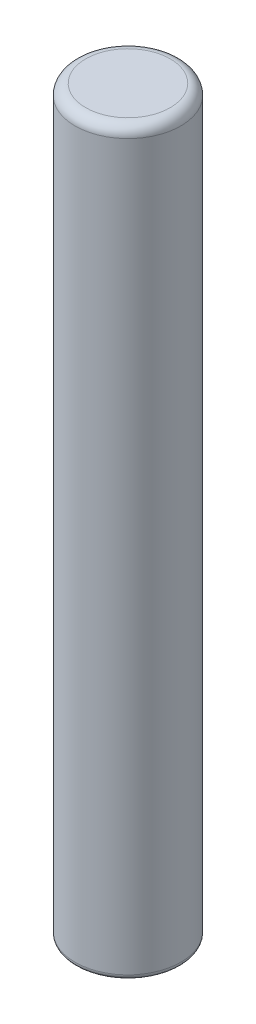
ISO-10303-21;
HEADER;
FILE_DESCRIPTION(('STEP AP214'),'2;1');
FILE_NAME('part.step','',(''),(''),'','','');
FILE_SCHEMA(('AUTOMOTIVE_DESIGN { 1 0 10303 214 1 1 1 1 }'));
ENDSEC;
DATA;
#1=APPLICATION_CONTEXT('core data for automotive mechanical design processes');
#2=APPLICATION_PROTOCOL_DEFINITION('international standard','automotive_design',2000,#1);
#3=PRODUCT_CONTEXT('',#1,'mechanical');
#4=PRODUCT('Part','Part','',(#3));
#5=PRODUCT_RELATED_PRODUCT_CATEGORY('part','',(#4));
#6=PRODUCT_DEFINITION_FORMATION('','',#4);
#7=PRODUCT_DEFINITION_CONTEXT('part definition',#1,'design');
#8=PRODUCT_DEFINITION('design','',#6,#7);
#9=PRODUCT_DEFINITION_SHAPE('','',#8);
#10=(LENGTH_UNIT() NAMED_UNIT(*) SI_UNIT(.MILLI.,.METRE.));
#11=(NAMED_UNIT(*) PLANE_ANGLE_UNIT() SI_UNIT($,.RADIAN.));
#12=(NAMED_UNIT(*) SI_UNIT($,.STERADIAN.) SOLID_ANGLE_UNIT());
#13=UNCERTAINTY_MEASURE_WITH_UNIT(LENGTH_MEASURE(1.E-05),#10,'distance_accuracy_value','');
#14=(GEOMETRIC_REPRESENTATION_CONTEXT(3) GLOBAL_UNCERTAINTY_ASSIGNED_CONTEXT((#13)) GLOBAL_UNIT_ASSIGNED_CONTEXT((#10,
#11,#12)) REPRESENTATION_CONTEXT('',''));
#15=CARTESIAN_POINT('',(0.,0.,0.));
#16=DIRECTION('',(0.,0.,1.));
#17=DIRECTION('',(1.,0.,0.));
#18=AXIS2_PLACEMENT_3D('',#15,#16,#17);
#19=CARTESIAN_POINT('',(0.,-7.,0.));
#20=DIRECTION('',(0.,1.,0.));
#21=DIRECTION('',(0.,0.,1.));
#22=AXIS2_PLACEMENT_3D('',#19,#20,#21);
#23=CYLINDRICAL_SURFACE('',#22,1.);
#24=CARTESIAN_POINT('',(0.,-6.9,0.));
#25=DIRECTION('',(0.,1.,0.));
#26=DIRECTION('',(0.,0.,1.));
#27=AXIS2_PLACEMENT_3D('',#24,#25,#26);
#28=CIRCLE('',#27,1.);
#29=CARTESIAN_POINT('',(0.,-6.9,1.));
#30=VERTEX_POINT('',#29);
#31=EDGE_CURVE('E48',#30,#30,#28,.T.);
#32=ORIENTED_EDGE('',*,*,#31,.T.);
#33=EDGE_LOOP('',(#32));
#34=FACE_BOUND('',#33,.T.);
#35=CARTESIAN_POINT('',(0.,6.8,0.));
#36=DIRECTION('',(0.,1.,0.));
#37=DIRECTION('',(0.,0.,1.));
#38=AXIS2_PLACEMENT_3D('',#35,#36,#37);
#39=CIRCLE('',#38,1.);
#40=CARTESIAN_POINT('',(0.,6.8,1.));
#41=VERTEX_POINT('',#40);
#42=EDGE_CURVE('E52',#41,#41,#39,.F.);
#43=ORIENTED_EDGE('',*,*,#42,.T.);
#44=EDGE_LOOP('',(#43));
#45=FACE_BOUND('',#44,.T.);
#46=ADVANCED_FACE('F37',(#34,#45),#23,.T.);
#47=CARTESIAN_POINT('',(0.,-7.,0.));
#48=DIRECTION('',(0.,1.,0.));
#49=DIRECTION('',(0.,0.,1.));
#50=AXIS2_PLACEMENT_3D('',#47,#48,#49);
#51=PLANE('',#50);
#52=CARTESIAN_POINT('',(0.,-7.,0.));
#53=DIRECTION('',(0.,1.,0.));
#54=DIRECTION('',(0.,0.,1.));
#55=AXIS2_PLACEMENT_3D('',#52,#53,#54);
#56=CIRCLE('',#55,0.9);
#57=CARTESIAN_POINT('',(0.,-7.,0.9));
#58=VERTEX_POINT('',#57);
#59=EDGE_CURVE('E44',#58,#58,#56,.F.);
#60=ORIENTED_EDGE('',*,*,#59,.T.);
#61=EDGE_LOOP('',(#60));
#62=FACE_BOUND('',#61,.T.);
#63=ADVANCED_FACE('F68',(#62),#51,.F.);
#64=CARTESIAN_POINT('',(0.,7.,0.));
#65=DIRECTION('',(0.,1.,0.));
#66=DIRECTION('',(0.,0.,1.));
#67=AXIS2_PLACEMENT_3D('',#64,#65,#66);
#68=PLANE('',#67);
#69=CARTESIAN_POINT('',(0.,7.,0.));
#70=DIRECTION('',(0.,1.,0.));
#71=DIRECTION('',(0.,0.,1.));
#72=AXIS2_PLACEMENT_3D('',#69,#70,#71);
#73=CIRCLE('',#72,0.8);
#74=CARTESIAN_POINT('',(0.,7.,0.8));
#75=VERTEX_POINT('',#74);
#76=EDGE_CURVE('E11',#75,#75,#73,.T.);
#77=ORIENTED_EDGE('',*,*,#76,.T.);
#78=EDGE_LOOP('',(#77));
#79=FACE_BOUND('',#78,.T.);
#80=ADVANCED_FACE('F65',(#79),#68,.T.);
#81=CARTESIAN_POINT('',(0.,-6.9,0.));
#82=DIRECTION('',(0.,1.,0.));
#83=DIRECTION('',(0.,0.,1.));
#84=AXIS2_PLACEMENT_3D('',#81,#82,#83);
#85=TOROIDAL_SURFACE('',#84,0.9,0.1);
#86=ORIENTED_EDGE('',*,*,#59,.F.);
#87=EDGE_LOOP('',(#86));
#88=FACE_BOUND('',#87,.T.);
#89=ORIENTED_EDGE('',*,*,#31,.F.);
#90=EDGE_LOOP('',(#89));
#91=FACE_BOUND('',#90,.T.);
#92=ADVANCED_FACE('F61',(#88,#91),#85,.T.);
#93=CARTESIAN_POINT('',(0.,6.8,0.));
#94=DIRECTION('',(0.,1.,0.));
#95=DIRECTION('',(0.,0.,1.));
#96=AXIS2_PLACEMENT_3D('',#93,#94,#95);
#97=TOROIDAL_SURFACE('',#96,0.8,0.2);
#98=ORIENTED_EDGE('',*,*,#42,.F.);
#99=EDGE_LOOP('',(#98));
#100=FACE_BOUND('',#99,.T.);
#101=ORIENTED_EDGE('',*,*,#76,.F.);
#102=EDGE_LOOP('',(#101));
#103=FACE_BOUND('',#102,.T.);
#104=ADVANCED_FACE('F39',(#100,#103),#97,.T.);
#105=CLOSED_SHELL('',(#46,#63,#80,#92,#104));
#106=MANIFOLD_SOLID_BREP('B2',#105);
#107=ADVANCED_BREP_SHAPE_REPRESENTATION('',(#18,#106),#14);
#108=SHAPE_DEFINITION_REPRESENTATION(#9,#107);
ENDSEC;
END-ISO-10303-21;
